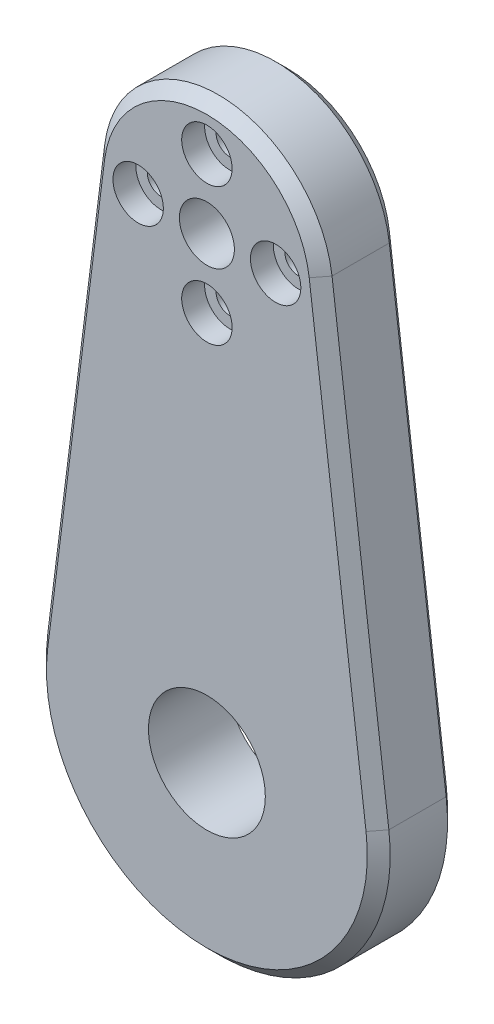
ISO-10303-21;
HEADER;
FILE_DESCRIPTION(('STEP AP214'),'2;1');
FILE_NAME('part.step','',(''),(''),'','','');
FILE_SCHEMA(('AUTOMOTIVE_DESIGN { 1 0 10303 214 1 1 1 1 }'));
ENDSEC;
DATA;
#1=APPLICATION_CONTEXT('core data for automotive mechanical design processes');
#2=APPLICATION_PROTOCOL_DEFINITION('international standard','automotive_design',2000,#1);
#3=PRODUCT_CONTEXT('',#1,'mechanical');
#4=PRODUCT('Part','Part','',(#3));
#5=PRODUCT_RELATED_PRODUCT_CATEGORY('part','',(#4));
#6=PRODUCT_DEFINITION_FORMATION('','',#4);
#7=PRODUCT_DEFINITION_CONTEXT('part definition',#1,'design');
#8=PRODUCT_DEFINITION('design','',#6,#7);
#9=PRODUCT_DEFINITION_SHAPE('','',#8);
#10=(LENGTH_UNIT() NAMED_UNIT(*) SI_UNIT(.MILLI.,.METRE.));
#11=(NAMED_UNIT(*) PLANE_ANGLE_UNIT() SI_UNIT($,.RADIAN.));
#12=(NAMED_UNIT(*) SI_UNIT($,.STERADIAN.) SOLID_ANGLE_UNIT());
#13=UNCERTAINTY_MEASURE_WITH_UNIT(LENGTH_MEASURE(1.E-05),#10,'distance_accuracy_value','');
#14=(GEOMETRIC_REPRESENTATION_CONTEXT(3) GLOBAL_UNCERTAINTY_ASSIGNED_CONTEXT((#13)) GLOBAL_UNIT_ASSIGNED_CONTEXT((#10,
#11,#12)) REPRESENTATION_CONTEXT('',''));
#15=CARTESIAN_POINT('',(0.,0.,0.));
#16=DIRECTION('',(0.,0.,1.));
#17=DIRECTION('',(1.,0.,0.));
#18=AXIS2_PLACEMENT_3D('',#15,#16,#17);
#19=CARTESIAN_POINT('',(0.,-40.,7.));
#20=DIRECTION('',(0.,0.,1.));
#21=DIRECTION('',(1.,0.,0.));
#22=AXIS2_PLACEMENT_3D('',#19,#20,#21);
#23=PLANE('',#22);
#24=CARTESIAN_POINT('',(0.,-40.,7.));
#25=DIRECTION('',(0.,0.,1.));
#26=DIRECTION('',(1.,0.,0.));
#27=AXIS2_PLACEMENT_3D('',#24,#25,#26);
#28=CIRCLE('',#27,14.);
#29=CARTESIAN_POINT('',(-13.8901943830891,-38.25,7.));
#30=VERTEX_POINT('',#29);
#31=CARTESIAN_POINT('',(13.8901943830891,-38.25,7.));
#32=VERTEX_POINT('',#31);
#33=EDGE_CURVE('E67',#30,#32,#28,.T.);
#34=ORIENTED_EDGE('',*,*,#33,.T.);
#35=DIRECTION('',(-0.125,0.992156741649222,0.));
#36=VECTOR('',#35,1.);
#37=CARTESIAN_POINT('',(8.929410674843,1.125,7.));
#38=LINE('',#37,#36);
#39=CARTESIAN_POINT('',(8.929410674843,1.125,7.));
#40=VERTEX_POINT('',#39);
#41=EDGE_CURVE('E11',#32,#40,#38,.T.);
#42=ORIENTED_EDGE('',*,*,#41,.T.);
#43=CARTESIAN_POINT('',(0.,0.,7.));
#44=DIRECTION('',(0.,0.,1.));
#45=DIRECTION('',(1.,0.,0.));
#46=AXIS2_PLACEMENT_3D('',#43,#44,#45);
#47=CIRCLE('',#46,9.00000000000001);
#48=CARTESIAN_POINT('',(-8.929410674843,1.125,7.));
#49=VERTEX_POINT('',#48);
#50=EDGE_CURVE('E52',#40,#49,#47,.T.);
#51=ORIENTED_EDGE('',*,*,#50,.T.);
#52=DIRECTION('',(-0.125,-0.992156741649222,0.));
#53=VECTOR('',#52,1.);
#54=CARTESIAN_POINT('',(-13.8901943830891,-38.25,7.));
#55=LINE('',#54,#53);
#56=EDGE_CURVE('E299',#49,#30,#55,.T.);
#57=ORIENTED_EDGE('',*,*,#56,.T.);
#58=EDGE_LOOP('',(#34,#42,#51,#57));
#59=FACE_BOUND('',#58,.T.);
#60=CARTESIAN_POINT('',(0.,6.,7.));
#61=DIRECTION('',(0.,0.,1.));
#62=DIRECTION('',(1.,0.,0.));
#63=AXIS2_PLACEMENT_3D('',#60,#61,#62);
#64=CIRCLE('',#63,2.19999999999999);
#65=CARTESIAN_POINT('',(2.19999999999999,6.,7.));
#66=VERTEX_POINT('',#65);
#67=EDGE_CURVE('E176',#66,#66,#64,.T.);
#68=ORIENTED_EDGE('',*,*,#67,.F.);
#69=EDGE_LOOP('',(#68));
#70=FACE_BOUND('',#69,.T.);
#71=CARTESIAN_POINT('',(6.,0.,7.));
#72=DIRECTION('',(0.,0.,1.));
#73=DIRECTION('',(1.,0.,0.));
#74=AXIS2_PLACEMENT_3D('',#71,#72,#73);
#75=CIRCLE('',#74,2.19999999999999);
#76=CARTESIAN_POINT('',(8.19999999999999,0.,7.));
#77=VERTEX_POINT('',#76);
#78=EDGE_CURVE('E199',#77,#77,#75,.T.);
#79=ORIENTED_EDGE('',*,*,#78,.F.);
#80=EDGE_LOOP('',(#79));
#81=FACE_BOUND('',#80,.T.);
#82=CARTESIAN_POINT('',(0.,-6.,7.));
#83=DIRECTION('',(0.,0.,1.));
#84=DIRECTION('',(1.,0.,0.));
#85=AXIS2_PLACEMENT_3D('',#82,#83,#84);
#86=CIRCLE('',#85,2.19999999999999);
#87=CARTESIAN_POINT('',(2.19999999999999,-6.,7.));
#88=VERTEX_POINT('',#87);
#89=EDGE_CURVE('E215',#88,#88,#86,.T.);
#90=ORIENTED_EDGE('',*,*,#89,.F.);
#91=EDGE_LOOP('',(#90));
#92=FACE_BOUND('',#91,.T.);
#93=CARTESIAN_POINT('',(-6.,0.,7.));
#94=DIRECTION('',(0.,0.,1.));
#95=DIRECTION('',(1.,0.,0.));
#96=AXIS2_PLACEMENT_3D('',#93,#94,#95);
#97=CIRCLE('',#96,2.19999999999999);
#98=CARTESIAN_POINT('',(-3.80000000000001,0.,7.));
#99=VERTEX_POINT('',#98);
#100=EDGE_CURVE('E231',#99,#99,#97,.T.);
#101=ORIENTED_EDGE('',*,*,#100,.F.);
#102=EDGE_LOOP('',(#101));
#103=FACE_BOUND('',#102,.T.);
#104=CARTESIAN_POINT('',(0.,0.,7.));
#105=DIRECTION('',(0.,0.,1.));
#106=DIRECTION('',(1.,0.,0.));
#107=AXIS2_PLACEMENT_3D('',#104,#105,#106);
#108=CIRCLE('',#107,2.4);
#109=CARTESIAN_POINT('',(2.4,0.,7.));
#110=VERTEX_POINT('',#109);
#111=EDGE_CURVE('E256',#110,#110,#108,.T.);
#112=ORIENTED_EDGE('',*,*,#111,.F.);
#113=EDGE_LOOP('',(#112));
#114=FACE_BOUND('',#113,.T.);
#115=CARTESIAN_POINT('',(0.,-40.,7.));
#116=DIRECTION('',(0.,0.,1.));
#117=DIRECTION('',(1.,0.,0.));
#118=AXIS2_PLACEMENT_3D('',#115,#116,#117);
#119=CIRCLE('',#118,5.1);
#120=CARTESIAN_POINT('',(5.1,-40.,7.));
#121=VERTEX_POINT('',#120);
#122=EDGE_CURVE('E248',#121,#121,#119,.T.);
#123=ORIENTED_EDGE('',*,*,#122,.F.);
#124=EDGE_LOOP('',(#123));
#125=FACE_BOUND('',#124,.T.);
#126=ADVANCED_FACE('F41',(#59,#70,#81,#92,#103,#114,#125),#23,.T.);
#127=CARTESIAN_POINT('',(0.,-40.,0.));
#128=DIRECTION('',(0.,0.,1.));
#129=DIRECTION('',(1.,0.,0.));
#130=AXIS2_PLACEMENT_3D('',#127,#128,#129);
#131=PLANE('',#130);
#132=CARTESIAN_POINT('',(0.,0.,0.));
#133=DIRECTION('',(0.,0.,1.));
#134=DIRECTION('',(1.,0.,0.));
#135=AXIS2_PLACEMENT_3D('',#132,#133,#134);
#136=CIRCLE('',#135,8.99999999999999);
#137=CARTESIAN_POINT('',(-8.92941067484298,1.125,0.));
#138=VERTEX_POINT('',#137);
#139=CARTESIAN_POINT('',(8.92941067484298,1.125,0.));
#140=VERTEX_POINT('',#139);
#141=EDGE_CURVE('E279',#138,#140,#136,.F.);
#142=ORIENTED_EDGE('',*,*,#141,.T.);
#143=DIRECTION('',(0.125,-0.992156741649222,0.));
#144=VECTOR('',#143,1.);
#145=CARTESIAN_POINT('',(13.8901943830891,-38.25,0.));
#146=LINE('',#145,#144);
#147=CARTESIAN_POINT('',(13.8901943830891,-38.25,0.));
#148=VERTEX_POINT('',#147);
#149=EDGE_CURVE('E124',#140,#148,#146,.T.);
#150=ORIENTED_EDGE('',*,*,#149,.T.);
#151=CARTESIAN_POINT('',(0.,-40.,0.));
#152=DIRECTION('',(0.,0.,1.));
#153=DIRECTION('',(1.,0.,0.));
#154=AXIS2_PLACEMENT_3D('',#151,#152,#153);
#155=CIRCLE('',#154,14.);
#156=CARTESIAN_POINT('',(-13.8901943830891,-38.25,0.));
#157=VERTEX_POINT('',#156);
#158=EDGE_CURVE('E276',#148,#157,#155,.F.);
#159=ORIENTED_EDGE('',*,*,#158,.T.);
#160=DIRECTION('',(0.125,0.992156741649222,0.));
#161=VECTOR('',#160,1.);
#162=CARTESIAN_POINT('',(-13.8901943830891,-38.25,0.));
#163=LINE('',#162,#161);
#164=EDGE_CURVE('E273',#157,#138,#163,.T.);
#165=ORIENTED_EDGE('',*,*,#164,.T.);
#166=EDGE_LOOP('',(#142,#150,#159,#165));
#167=FACE_BOUND('',#166,.T.);
#168=CARTESIAN_POINT('',(0.,6.,0.));
#169=DIRECTION('',(0.,0.,1.));
#170=DIRECTION('',(1.,0.,0.));
#171=AXIS2_PLACEMENT_3D('',#168,#169,#170);
#172=CIRCLE('',#171,1.2);
#173=CARTESIAN_POINT('',(1.2,6.,0.));
#174=VERTEX_POINT('',#173);
#175=EDGE_CURVE('E195',#174,#174,#172,.T.);
#176=ORIENTED_EDGE('',*,*,#175,.T.);
#177=EDGE_LOOP('',(#176));
#178=FACE_BOUND('',#177,.T.);
#179=CARTESIAN_POINT('',(6.,0.,0.));
#180=DIRECTION('',(0.,0.,1.));
#181=DIRECTION('',(1.,0.,0.));
#182=AXIS2_PLACEMENT_3D('',#179,#180,#181);
#183=CIRCLE('',#182,1.2);
#184=CARTESIAN_POINT('',(7.2,0.,0.));
#185=VERTEX_POINT('',#184);
#186=EDGE_CURVE('E211',#185,#185,#183,.T.);
#187=ORIENTED_EDGE('',*,*,#186,.T.);
#188=EDGE_LOOP('',(#187));
#189=FACE_BOUND('',#188,.T.);
#190=CARTESIAN_POINT('',(0.,-6.,0.));
#191=DIRECTION('',(0.,0.,1.));
#192=DIRECTION('',(1.,0.,0.));
#193=AXIS2_PLACEMENT_3D('',#190,#191,#192);
#194=CIRCLE('',#193,1.2);
#195=CARTESIAN_POINT('',(1.2,-6.,0.));
#196=VERTEX_POINT('',#195);
#197=EDGE_CURVE('E227',#196,#196,#194,.T.);
#198=ORIENTED_EDGE('',*,*,#197,.T.);
#199=EDGE_LOOP('',(#198));
#200=FACE_BOUND('',#199,.T.);
#201=CARTESIAN_POINT('',(-6.,0.,0.));
#202=DIRECTION('',(0.,0.,1.));
#203=DIRECTION('',(1.,0.,0.));
#204=AXIS2_PLACEMENT_3D('',#201,#202,#203);
#205=CIRCLE('',#204,1.2);
#206=CARTESIAN_POINT('',(-4.8,0.,0.));
#207=VERTEX_POINT('',#206);
#208=EDGE_CURVE('E243',#207,#207,#205,.T.);
#209=ORIENTED_EDGE('',*,*,#208,.T.);
#210=EDGE_LOOP('',(#209));
#211=FACE_BOUND('',#210,.T.);
#212=CARTESIAN_POINT('',(0.,0.,0.));
#213=DIRECTION('',(0.,0.,1.));
#214=DIRECTION('',(1.,0.,0.));
#215=AXIS2_PLACEMENT_3D('',#212,#213,#214);
#216=CIRCLE('',#215,2.4);
#217=CARTESIAN_POINT('',(2.4,0.,0.));
#218=VERTEX_POINT('',#217);
#219=EDGE_CURVE('E252',#218,#218,#216,.T.);
#220=ORIENTED_EDGE('',*,*,#219,.T.);
#221=EDGE_LOOP('',(#220));
#222=FACE_BOUND('',#221,.T.);
#223=CARTESIAN_POINT('',(0.,-40.,0.));
#224=DIRECTION('',(0.,0.,1.));
#225=DIRECTION('',(1.,0.,0.));
#226=AXIS2_PLACEMENT_3D('',#223,#224,#225);
#227=CIRCLE('',#226,5.1);
#228=CARTESIAN_POINT('',(5.1,-40.,0.));
#229=VERTEX_POINT('',#228);
#230=EDGE_CURVE('E247',#229,#229,#227,.T.);
#231=ORIENTED_EDGE('',*,*,#230,.T.);
#232=EDGE_LOOP('',(#231));
#233=FACE_BOUND('',#232,.T.);
#234=ADVANCED_FACE('F332',(#167,#178,#189,#200,#211,#222,#233),#131,.F.);
#235=CARTESIAN_POINT('',(0.,-40.,7.));
#236=DIRECTION('',(0.,0.,-1.));
#237=DIRECTION('',(-1.,0.,0.));
#238=AXIS2_PLACEMENT_3D('',#235,#236,#237);
#239=CYLINDRICAL_SURFACE('',#238,15.);
#240=DIRECTION('',(0.,0.,-1.));
#241=VECTOR('',#240,1.);
#242=CARTESIAN_POINT('',(-14.8823511247383,-38.125,7.));
#243=LINE('',#242,#241);
#244=CARTESIAN_POINT('',(-14.8823511247383,-38.125,6.00000000000001));
#245=VERTEX_POINT('',#244);
#246=CARTESIAN_POINT('',(-14.8823511247383,-38.125,1.00000000000001));
#247=VERTEX_POINT('',#246);
#248=EDGE_CURVE('E260',#245,#247,#243,.T.);
#249=ORIENTED_EDGE('',*,*,#248,.T.);
#250=CARTESIAN_POINT('',(0.,-40.,1.00000000000001));
#251=DIRECTION('',(0.,0.,1.));
#252=DIRECTION('',(1.,0.,0.));
#253=AXIS2_PLACEMENT_3D('',#250,#251,#252);
#254=CIRCLE('',#253,15.);
#255=CARTESIAN_POINT('',(14.8823511247383,-38.125,1.00000000000001));
#256=VERTEX_POINT('',#255);
#257=EDGE_CURVE('E290',#247,#256,#254,.T.);
#258=ORIENTED_EDGE('',*,*,#257,.T.);
#259=DIRECTION('',(0.,0.,-1.));
#260=VECTOR('',#259,1.);
#261=CARTESIAN_POINT('',(14.8823511247383,-38.125,7.));
#262=LINE('',#261,#260);
#263=CARTESIAN_POINT('',(14.8823511247383,-38.125,6.00000000000001));
#264=VERTEX_POINT('',#263);
#265=EDGE_CURVE('E136',#264,#256,#262,.T.);
#266=ORIENTED_EDGE('',*,*,#265,.F.);
#267=CARTESIAN_POINT('',(0.,-40.,6.00000000000001));
#268=DIRECTION('',(0.,0.,1.));
#269=DIRECTION('',(1.,0.,0.));
#270=AXIS2_PLACEMENT_3D('',#267,#268,#269);
#271=CIRCLE('',#270,15.);
#272=EDGE_CURVE('E287',#264,#245,#271,.F.);
#273=ORIENTED_EDGE('',*,*,#272,.T.);
#274=EDGE_LOOP('',(#249,#258,#266,#273));
#275=FACE_BOUND('',#274,.T.);
#276=ADVANCED_FACE('F311',(#275),#239,.T.);
#277=CARTESIAN_POINT('',(14.8823511247383,-38.125,7.));
#278=DIRECTION('',(-0.992156741649221,-0.125,0.));
#279=DIRECTION('',(0.125,-0.992156741649222,0.));
#280=AXIS2_PLACEMENT_3D('',#277,#278,#279);
#281=PLANE('',#280);
#282=ORIENTED_EDGE('',*,*,#265,.T.);
#283=DIRECTION('',(-0.125,0.992156741649222,0.));
#284=VECTOR('',#283,1.);
#285=CARTESIAN_POINT('',(14.8823511247383,-38.125,1.00000000000001));
#286=LINE('',#285,#284);
#287=CARTESIAN_POINT('',(9.92156741649221,1.25,1.00000000000001));
#288=VERTEX_POINT('',#287);
#289=EDGE_CURVE('E134',#256,#288,#286,.T.);
#290=ORIENTED_EDGE('',*,*,#289,.T.);
#291=DIRECTION('',(0.,0.,-1.));
#292=VECTOR('',#291,1.);
#293=CARTESIAN_POINT('',(9.92156741649221,1.25,7.));
#294=LINE('',#293,#292);
#295=CARTESIAN_POINT('',(9.92156741649221,1.25,6.00000000000001));
#296=VERTEX_POINT('',#295);
#297=EDGE_CURVE('E116',#296,#288,#294,.T.);
#298=ORIENTED_EDGE('',*,*,#297,.F.);
#299=DIRECTION('',(0.125,-0.992156741649222,0.));
#300=VECTOR('',#299,1.);
#301=CARTESIAN_POINT('',(14.8823511247383,-38.125,6.00000000000001));
#302=LINE('',#301,#300);
#303=EDGE_CURVE('E131',#296,#264,#302,.T.);
#304=ORIENTED_EDGE('',*,*,#303,.T.);
#305=EDGE_LOOP('',(#282,#290,#298,#304));
#306=FACE_BOUND('',#305,.T.);
#307=ADVANCED_FACE('F130',(#306),#281,.F.);
#308=CARTESIAN_POINT('',(0.,0.,7.));
#309=DIRECTION('',(0.,0.,-1.));
#310=DIRECTION('',(-1.,0.,0.));
#311=AXIS2_PLACEMENT_3D('',#308,#309,#310);
#312=CYLINDRICAL_SURFACE('',#311,10.);
#313=ORIENTED_EDGE('',*,*,#297,.T.);
#314=CARTESIAN_POINT('',(0.,0.,1.00000000000001));
#315=DIRECTION('',(0.,0.,1.));
#316=DIRECTION('',(1.,0.,0.));
#317=AXIS2_PLACEMENT_3D('',#314,#315,#316);
#318=CIRCLE('',#317,10.);
#319=CARTESIAN_POINT('',(-9.92156741649221,1.25,1.00000000000001));
#320=VERTEX_POINT('',#319);
#321=EDGE_CURVE('E123',#288,#320,#318,.T.);
#322=ORIENTED_EDGE('',*,*,#321,.T.);
#323=DIRECTION('',(0.,0.,-1.));
#324=VECTOR('',#323,1.);
#325=CARTESIAN_POINT('',(-9.92156741649221,1.25,7.));
#326=LINE('',#325,#324);
#327=CARTESIAN_POINT('',(-9.92156741649221,1.25,6.00000000000001));
#328=VERTEX_POINT('',#327);
#329=EDGE_CURVE('E118',#328,#320,#326,.T.);
#330=ORIENTED_EDGE('',*,*,#329,.F.);
#331=CARTESIAN_POINT('',(0.,0.,6.00000000000001));
#332=DIRECTION('',(0.,0.,1.));
#333=DIRECTION('',(1.,0.,0.));
#334=AXIS2_PLACEMENT_3D('',#331,#332,#333);
#335=CIRCLE('',#334,10.);
#336=EDGE_CURVE('E113',#328,#296,#335,.F.);
#337=ORIENTED_EDGE('',*,*,#336,.T.);
#338=EDGE_LOOP('',(#313,#322,#330,#337));
#339=FACE_BOUND('',#338,.T.);
#340=ADVANCED_FACE('F115',(#339),#312,.T.);
#341=CARTESIAN_POINT('',(-14.8823511247383,-38.125,7.));
#342=DIRECTION('',(0.992156741649221,-0.125,0.));
#343=DIRECTION('',(0.125,0.992156741649222,0.));
#344=AXIS2_PLACEMENT_3D('',#341,#342,#343);
#345=PLANE('',#344);
#346=ORIENTED_EDGE('',*,*,#329,.T.);
#347=DIRECTION('',(-0.125,-0.992156741649222,0.));
#348=VECTOR('',#347,1.);
#349=CARTESIAN_POINT('',(-14.8823511247383,-38.125,1.00000000000001));
#350=LINE('',#349,#348);
#351=EDGE_CURVE('E296',#320,#247,#350,.T.);
#352=ORIENTED_EDGE('',*,*,#351,.T.);
#353=ORIENTED_EDGE('',*,*,#248,.F.);
#354=DIRECTION('',(0.125,0.992156741649222,0.));
#355=VECTOR('',#354,1.);
#356=CARTESIAN_POINT('',(-9.92156741649221,1.25,6.00000000000001));
#357=LINE('',#356,#355);
#358=EDGE_CURVE('E293',#245,#328,#357,.T.);
#359=ORIENTED_EDGE('',*,*,#358,.T.);
#360=EDGE_LOOP('',(#346,#352,#353,#359));
#361=FACE_BOUND('',#360,.T.);
#362=ADVANCED_FACE('F313',(#361),#345,.F.);
#363=CARTESIAN_POINT('',(0.,0.,7.));
#364=DIRECTION('',(0.,0.,-1.));
#365=DIRECTION('',(-1.,0.,0.));
#366=AXIS2_PLACEMENT_3D('',#363,#364,#365);
#367=CYLINDRICAL_SURFACE('',#366,2.4);
#368=ORIENTED_EDGE('',*,*,#111,.T.);
#369=EDGE_LOOP('',(#368));
#370=FACE_BOUND('',#369,.T.);
#371=ORIENTED_EDGE('',*,*,#219,.F.);
#372=EDGE_LOOP('',(#371));
#373=FACE_BOUND('',#372,.T.);
#374=ADVANCED_FACE('F340',(#370,#373),#367,.F.);
#375=CARTESIAN_POINT('',(0.,-40.,7.));
#376=DIRECTION('',(0.,0.,-1.));
#377=DIRECTION('',(-1.,0.,0.));
#378=AXIS2_PLACEMENT_3D('',#375,#376,#377);
#379=CYLINDRICAL_SURFACE('',#378,5.1);
#380=ORIENTED_EDGE('',*,*,#122,.T.);
#381=EDGE_LOOP('',(#380));
#382=FACE_BOUND('',#381,.T.);
#383=ORIENTED_EDGE('',*,*,#230,.F.);
#384=EDGE_LOOP('',(#383));
#385=FACE_BOUND('',#384,.T.);
#386=ADVANCED_FACE('F372',(#382,#385),#379,.F.);
#387=CARTESIAN_POINT('',(-6.,0.,7.));
#388=DIRECTION('',(0.,0.,1.));
#389=DIRECTION('',(1.,0.,0.));
#390=AXIS2_PLACEMENT_3D('',#387,#388,#389);
#391=CYLINDRICAL_SURFACE('',#390,1.2);
#392=ORIENTED_EDGE('',*,*,#208,.F.);
#393=EDGE_LOOP('',(#392));
#394=FACE_BOUND('',#393,.T.);
#395=CARTESIAN_POINT('',(-6.,0.,5.));
#396=DIRECTION('',(0.,0.,1.));
#397=DIRECTION('',(1.,0.,0.));
#398=AXIS2_PLACEMENT_3D('',#395,#396,#397);
#399=CIRCLE('',#398,1.2);
#400=CARTESIAN_POINT('',(-4.8,0.,5.));
#401=VERTEX_POINT('',#400);
#402=EDGE_CURVE('E239',#401,#401,#399,.T.);
#403=ORIENTED_EDGE('',*,*,#402,.T.);
#404=EDGE_LOOP('',(#403));
#405=FACE_BOUND('',#404,.T.);
#406=ADVANCED_FACE('F379',(#394,#405),#391,.F.);
#407=CARTESIAN_POINT('',(-4.8,0.,5.));
#408=DIRECTION('',(0.,0.,-1.));
#409=DIRECTION('',(-1.,0.,0.));
#410=AXIS2_PLACEMENT_3D('',#407,#408,#409);
#411=PLANE('',#410);
#412=ORIENTED_EDGE('',*,*,#402,.F.);
#413=EDGE_LOOP('',(#412));
#414=FACE_BOUND('',#413,.T.);
#415=CARTESIAN_POINT('',(-6.,0.,5.));
#416=DIRECTION('',(0.,0.,1.));
#417=DIRECTION('',(1.,0.,0.));
#418=AXIS2_PLACEMENT_3D('',#415,#416,#417);
#419=CIRCLE('',#418,2.2);
#420=CARTESIAN_POINT('',(-3.8,0.,5.));
#421=VERTEX_POINT('',#420);
#422=EDGE_CURVE('E235',#421,#421,#419,.T.);
#423=ORIENTED_EDGE('',*,*,#422,.T.);
#424=EDGE_LOOP('',(#423));
#425=FACE_BOUND('',#424,.T.);
#426=ADVANCED_FACE('F386',(#414,#425),#411,.F.);
#427=CARTESIAN_POINT('',(-6.,0.,7.));
#428=DIRECTION('',(0.,0.,1.));
#429=DIRECTION('',(1.,0.,0.));
#430=AXIS2_PLACEMENT_3D('',#427,#428,#429);
#431=CYLINDRICAL_SURFACE('',#430,2.19999999999999);
#432=ORIENTED_EDGE('',*,*,#422,.F.);
#433=EDGE_LOOP('',(#432));
#434=FACE_BOUND('',#433,.T.);
#435=ORIENTED_EDGE('',*,*,#100,.T.);
#436=EDGE_LOOP('',(#435));
#437=FACE_BOUND('',#436,.T.);
#438=ADVANCED_FACE('F394',(#434,#437),#431,.F.);
#439=CARTESIAN_POINT('',(0.,-6.,7.));
#440=DIRECTION('',(0.,0.,1.));
#441=DIRECTION('',(1.,0.,0.));
#442=AXIS2_PLACEMENT_3D('',#439,#440,#441);
#443=CYLINDRICAL_SURFACE('',#442,1.2);
#444=ORIENTED_EDGE('',*,*,#197,.F.);
#445=EDGE_LOOP('',(#444));
#446=FACE_BOUND('',#445,.T.);
#447=CARTESIAN_POINT('',(0.,-6.,5.));
#448=DIRECTION('',(0.,0.,1.));
#449=DIRECTION('',(1.,0.,0.));
#450=AXIS2_PLACEMENT_3D('',#447,#448,#449);
#451=CIRCLE('',#450,1.2);
#452=CARTESIAN_POINT('',(1.2,-6.,5.));
#453=VERTEX_POINT('',#452);
#454=EDGE_CURVE('E223',#453,#453,#451,.T.);
#455=ORIENTED_EDGE('',*,*,#454,.T.);
#456=EDGE_LOOP('',(#455));
#457=FACE_BOUND('',#456,.T.);
#458=ADVANCED_FACE('F402',(#446,#457),#443,.F.);
#459=CARTESIAN_POINT('',(1.2,-6.,5.));
#460=DIRECTION('',(0.,0.,-1.));
#461=DIRECTION('',(-1.,0.,0.));
#462=AXIS2_PLACEMENT_3D('',#459,#460,#461);
#463=PLANE('',#462);
#464=ORIENTED_EDGE('',*,*,#454,.F.);
#465=EDGE_LOOP('',(#464));
#466=FACE_BOUND('',#465,.T.);
#467=CARTESIAN_POINT('',(0.,-6.,5.));
#468=DIRECTION('',(0.,0.,1.));
#469=DIRECTION('',(1.,0.,0.));
#470=AXIS2_PLACEMENT_3D('',#467,#468,#469);
#471=CIRCLE('',#470,2.2);
#472=CARTESIAN_POINT('',(2.2,-6.,5.));
#473=VERTEX_POINT('',#472);
#474=EDGE_CURVE('E219',#473,#473,#471,.T.);
#475=ORIENTED_EDGE('',*,*,#474,.T.);
#476=EDGE_LOOP('',(#475));
#477=FACE_BOUND('',#476,.T.);
#478=ADVANCED_FACE('F410',(#466,#477),#463,.F.);
#479=CARTESIAN_POINT('',(0.,-6.,7.));
#480=DIRECTION('',(0.,0.,1.));
#481=DIRECTION('',(1.,0.,0.));
#482=AXIS2_PLACEMENT_3D('',#479,#480,#481);
#483=CYLINDRICAL_SURFACE('',#482,2.19999999999999);
#484=ORIENTED_EDGE('',*,*,#474,.F.);
#485=EDGE_LOOP('',(#484));
#486=FACE_BOUND('',#485,.T.);
#487=ORIENTED_EDGE('',*,*,#89,.T.);
#488=EDGE_LOOP('',(#487));
#489=FACE_BOUND('',#488,.T.);
#490=ADVANCED_FACE('F418',(#486,#489),#483,.F.);
#491=CARTESIAN_POINT('',(6.,0.,7.));
#492=DIRECTION('',(0.,0.,1.));
#493=DIRECTION('',(1.,0.,0.));
#494=AXIS2_PLACEMENT_3D('',#491,#492,#493);
#495=CYLINDRICAL_SURFACE('',#494,1.2);
#496=ORIENTED_EDGE('',*,*,#186,.F.);
#497=EDGE_LOOP('',(#496));
#498=FACE_BOUND('',#497,.T.);
#499=CARTESIAN_POINT('',(6.,0.,5.));
#500=DIRECTION('',(0.,0.,1.));
#501=DIRECTION('',(1.,0.,0.));
#502=AXIS2_PLACEMENT_3D('',#499,#500,#501);
#503=CIRCLE('',#502,1.2);
#504=CARTESIAN_POINT('',(7.2,0.,5.));
#505=VERTEX_POINT('',#504);
#506=EDGE_CURVE('E207',#505,#505,#503,.T.);
#507=ORIENTED_EDGE('',*,*,#506,.T.);
#508=EDGE_LOOP('',(#507));
#509=FACE_BOUND('',#508,.T.);
#510=ADVANCED_FACE('F426',(#498,#509),#495,.F.);
#511=CARTESIAN_POINT('',(7.2,0.,5.));
#512=DIRECTION('',(0.,0.,-1.));
#513=DIRECTION('',(-1.,0.,0.));
#514=AXIS2_PLACEMENT_3D('',#511,#512,#513);
#515=PLANE('',#514);
#516=ORIENTED_EDGE('',*,*,#506,.F.);
#517=EDGE_LOOP('',(#516));
#518=FACE_BOUND('',#517,.T.);
#519=CARTESIAN_POINT('',(6.,0.,5.));
#520=DIRECTION('',(0.,0.,1.));
#521=DIRECTION('',(1.,0.,0.));
#522=AXIS2_PLACEMENT_3D('',#519,#520,#521);
#523=CIRCLE('',#522,2.2);
#524=CARTESIAN_POINT('',(8.2,0.,5.));
#525=VERTEX_POINT('',#524);
#526=EDGE_CURVE('E203',#525,#525,#523,.T.);
#527=ORIENTED_EDGE('',*,*,#526,.T.);
#528=EDGE_LOOP('',(#527));
#529=FACE_BOUND('',#528,.T.);
#530=ADVANCED_FACE('F434',(#518,#529),#515,.F.);
#531=CARTESIAN_POINT('',(6.,0.,7.));
#532=DIRECTION('',(0.,0.,1.));
#533=DIRECTION('',(1.,0.,0.));
#534=AXIS2_PLACEMENT_3D('',#531,#532,#533);
#535=CYLINDRICAL_SURFACE('',#534,2.19999999999999);
#536=ORIENTED_EDGE('',*,*,#526,.F.);
#537=EDGE_LOOP('',(#536));
#538=FACE_BOUND('',#537,.T.);
#539=ORIENTED_EDGE('',*,*,#78,.T.);
#540=EDGE_LOOP('',(#539));
#541=FACE_BOUND('',#540,.T.);
#542=ADVANCED_FACE('F442',(#538,#541),#535,.F.);
#543=CARTESIAN_POINT('',(0.,6.,7.));
#544=DIRECTION('',(0.,0.,1.));
#545=DIRECTION('',(1.,0.,0.));
#546=AXIS2_PLACEMENT_3D('',#543,#544,#545);
#547=CYLINDRICAL_SURFACE('',#546,1.2);
#548=ORIENTED_EDGE('',*,*,#175,.F.);
#549=EDGE_LOOP('',(#548));
#550=FACE_BOUND('',#549,.T.);
#551=CARTESIAN_POINT('',(0.,6.,5.));
#552=DIRECTION('',(0.,0.,1.));
#553=DIRECTION('',(1.,0.,0.));
#554=AXIS2_PLACEMENT_3D('',#551,#552,#553);
#555=CIRCLE('',#554,1.2);
#556=CARTESIAN_POINT('',(1.2,6.,5.));
#557=VERTEX_POINT('',#556);
#558=EDGE_CURVE('E189',#557,#557,#555,.T.);
#559=ORIENTED_EDGE('',*,*,#558,.T.);
#560=EDGE_LOOP('',(#559));
#561=FACE_BOUND('',#560,.T.);
#562=ADVANCED_FACE('F450',(#550,#561),#547,.F.);
#563=CARTESIAN_POINT('',(1.2,6.,5.));
#564=DIRECTION('',(0.,0.,-1.));
#565=DIRECTION('',(-1.,0.,0.));
#566=AXIS2_PLACEMENT_3D('',#563,#564,#565);
#567=PLANE('',#566);
#568=ORIENTED_EDGE('',*,*,#558,.F.);
#569=EDGE_LOOP('',(#568));
#570=FACE_BOUND('',#569,.T.);
#571=CARTESIAN_POINT('',(0.,6.,5.));
#572=DIRECTION('',(0.,0.,1.));
#573=DIRECTION('',(1.,0.,0.));
#574=AXIS2_PLACEMENT_3D('',#571,#572,#573);
#575=CIRCLE('',#574,2.2);
#576=CARTESIAN_POINT('',(2.2,6.,5.));
#577=VERTEX_POINT('',#576);
#578=EDGE_CURVE('E183',#577,#577,#575,.T.);
#579=ORIENTED_EDGE('',*,*,#578,.T.);
#580=EDGE_LOOP('',(#579));
#581=FACE_BOUND('',#580,.T.);
#582=ADVANCED_FACE('F458',(#570,#581),#567,.F.);
#583=CARTESIAN_POINT('',(0.,6.,7.));
#584=DIRECTION('',(0.,0.,1.));
#585=DIRECTION('',(1.,0.,0.));
#586=AXIS2_PLACEMENT_3D('',#583,#584,#585);
#587=CYLINDRICAL_SURFACE('',#586,2.19999999999999);
#588=ORIENTED_EDGE('',*,*,#578,.F.);
#589=EDGE_LOOP('',(#588));
#590=FACE_BOUND('',#589,.T.);
#591=ORIENTED_EDGE('',*,*,#67,.T.);
#592=EDGE_LOOP('',(#591));
#593=FACE_BOUND('',#592,.T.);
#594=ADVANCED_FACE('F466',(#590,#593),#587,.F.);
#595=CARTESIAN_POINT('',(-14.8823511247383,-38.125,1.00000000000001));
#596=DIRECTION('',(0.701560760020114,-0.0883883476483183,0.707106781186547));
#597=DIRECTION('',(-0.125,-0.992156741649222,0.));
#598=AXIS2_PLACEMENT_3D('',#595,#596,#597);
#599=PLANE('',#598);
#600=DIRECTION('',(-0.701560760020114,0.0883883476483183,0.707106781186548));
#601=VECTOR('',#600,1.);
#602=CARTESIAN_POINT('',(-8.92941067484298,1.125,0.));
#603=LINE('',#602,#601);
#604=EDGE_CURVE('E166',#138,#320,#603,.T.);
#605=ORIENTED_EDGE('',*,*,#604,.F.);
#606=ORIENTED_EDGE('',*,*,#164,.F.);
#607=DIRECTION('',(0.701560760020114,-0.0883883476483178,-0.707106781186548));
#608=VECTOR('',#607,1.);
#609=CARTESIAN_POINT('',(-14.8823511247383,-38.125,1.00000000000001));
#610=LINE('',#609,#608);
#611=EDGE_CURVE('E150',#247,#157,#610,.T.);
#612=ORIENTED_EDGE('',*,*,#611,.F.);
#613=ORIENTED_EDGE('',*,*,#351,.F.);
#614=EDGE_LOOP('',(#605,#606,#612,#613));
#615=FACE_BOUND('',#614,.T.);
#616=ADVANCED_FACE('F316',(#615),#599,.F.);
#617=CARTESIAN_POINT('',(0.,-40.,1.00000000000001));
#618=DIRECTION('',(0.,0.,1.));
#619=DIRECTION('',(1.,0.,0.));
#620=AXIS2_PLACEMENT_3D('',#617,#618,#619);
#621=CONICAL_SURFACE('',#620,15.,0.785398163397448);
#622=ORIENTED_EDGE('',*,*,#611,.T.);
#623=ORIENTED_EDGE('',*,*,#158,.F.);
#624=DIRECTION('',(-0.701560760020114,-0.0883883476483178,-0.707106781186548));
#625=VECTOR('',#624,1.);
#626=CARTESIAN_POINT('',(14.8823511247383,-38.125,1.00000000000001));
#627=LINE('',#626,#625);
#628=EDGE_CURVE('E159',#256,#148,#627,.T.);
#629=ORIENTED_EDGE('',*,*,#628,.F.);
#630=ORIENTED_EDGE('',*,*,#257,.F.);
#631=EDGE_LOOP('',(#622,#623,#629,#630));
#632=FACE_BOUND('',#631,.T.);
#633=ADVANCED_FACE('F319',(#632),#621,.T.);
#634=CARTESIAN_POINT('',(0.,0.,1.00000000000001));
#635=DIRECTION('',(0.,0.,1.));
#636=DIRECTION('',(1.,0.,0.));
#637=AXIS2_PLACEMENT_3D('',#634,#635,#636);
#638=CONICAL_SURFACE('',#637,10.,0.785398163397448);
#639=ORIENTED_EDGE('',*,*,#604,.T.);
#640=ORIENTED_EDGE('',*,*,#321,.F.);
#641=DIRECTION('',(0.701560760020114,0.0883883476483186,0.707106781186547));
#642=VECTOR('',#641,1.);
#643=CARTESIAN_POINT('',(8.92941067484298,1.125,0.));
#644=LINE('',#643,#642);
#645=EDGE_CURVE('E155',#140,#288,#644,.T.);
#646=ORIENTED_EDGE('',*,*,#645,.F.);
#647=ORIENTED_EDGE('',*,*,#141,.F.);
#648=EDGE_LOOP('',(#639,#640,#646,#647));
#649=FACE_BOUND('',#648,.T.);
#650=ADVANCED_FACE('F322',(#649),#638,.T.);
#651=CARTESIAN_POINT('',(14.8823511247383,-38.125,1.00000000000001));
#652=DIRECTION('',(-0.701560760020113,-0.0883883476483183,0.707106781186548));
#653=DIRECTION('',(-0.125,0.992156741649222,0.));
#654=AXIS2_PLACEMENT_3D('',#651,#652,#653);
#655=PLANE('',#654);
#656=ORIENTED_EDGE('',*,*,#628,.T.);
#657=ORIENTED_EDGE('',*,*,#149,.F.);
#658=ORIENTED_EDGE('',*,*,#645,.T.);
#659=ORIENTED_EDGE('',*,*,#289,.F.);
#660=EDGE_LOOP('',(#656,#657,#658,#659));
#661=FACE_BOUND('',#660,.T.);
#662=ADVANCED_FACE('F320',(#661),#655,.F.);
#663=CARTESIAN_POINT('',(-13.8901943830891,-38.25,7.));
#664=DIRECTION('',(-0.701560760020114,0.0883883476483183,0.707106781186547));
#665=DIRECTION('',(0.125,0.992156741649222,0.));
#666=AXIS2_PLACEMENT_3D('',#663,#664,#665);
#667=PLANE('',#666);
#668=DIRECTION('',(0.701560760020114,-0.0883883476483183,0.707106781186548));
#669=VECTOR('',#668,1.);
#670=CARTESIAN_POINT('',(-9.92156741649221,1.25,6.00000000000001));
#671=LINE('',#670,#669);
#672=EDGE_CURVE('E147',#328,#49,#671,.T.);
#673=ORIENTED_EDGE('',*,*,#672,.F.);
#674=ORIENTED_EDGE('',*,*,#358,.F.);
#675=DIRECTION('',(-0.701560760020114,0.088388347648319,-0.707106781186547));
#676=VECTOR('',#675,1.);
#677=CARTESIAN_POINT('',(-13.8901943830891,-38.25,7.));
#678=LINE('',#677,#676);
#679=EDGE_CURVE('E46',#30,#245,#678,.T.);
#680=ORIENTED_EDGE('',*,*,#679,.F.);
#681=ORIENTED_EDGE('',*,*,#56,.F.);
#682=EDGE_LOOP('',(#673,#674,#680,#681));
#683=FACE_BOUND('',#682,.T.);
#684=ADVANCED_FACE('F44',(#683),#667,.T.);
#685=CARTESIAN_POINT('',(0.,-40.,7.));
#686=DIRECTION('',(0.,0.,-1.));
#687=DIRECTION('',(-1.,0.,0.));
#688=AXIS2_PLACEMENT_3D('',#685,#686,#687);
#689=CONICAL_SURFACE('',#688,14.,0.785398163397448);
#690=ORIENTED_EDGE('',*,*,#679,.T.);
#691=ORIENTED_EDGE('',*,*,#272,.F.);
#692=DIRECTION('',(0.701560760020114,0.088388347648319,-0.707106781186547));
#693=VECTOR('',#692,1.);
#694=CARTESIAN_POINT('',(13.8901943830891,-38.25,7.));
#695=LINE('',#694,#693);
#696=EDGE_CURVE('E139',#32,#264,#695,.T.);
#697=ORIENTED_EDGE('',*,*,#696,.F.);
#698=ORIENTED_EDGE('',*,*,#33,.F.);
#699=EDGE_LOOP('',(#690,#691,#697,#698));
#700=FACE_BOUND('',#699,.T.);
#701=ADVANCED_FACE('F308',(#700),#689,.T.);
#702=CARTESIAN_POINT('',(0.,0.,7.));
#703=DIRECTION('',(0.,0.,-1.));
#704=DIRECTION('',(-1.,0.,0.));
#705=AXIS2_PLACEMENT_3D('',#702,#703,#704);
#706=CONICAL_SURFACE('',#705,9.00000000000001,0.785398163397448);
#707=ORIENTED_EDGE('',*,*,#672,.T.);
#708=ORIENTED_EDGE('',*,*,#50,.F.);
#709=DIRECTION('',(-0.701560760020114,-0.0883883476483186,0.707106781186547));
#710=VECTOR('',#709,1.);
#711=CARTESIAN_POINT('',(9.92156741649221,1.25,6.00000000000001));
#712=LINE('',#711,#710);
#713=EDGE_CURVE('E60',#296,#40,#712,.T.);
#714=ORIENTED_EDGE('',*,*,#713,.F.);
#715=ORIENTED_EDGE('',*,*,#336,.F.);
#716=EDGE_LOOP('',(#707,#708,#714,#715));
#717=FACE_BOUND('',#716,.T.);
#718=ADVANCED_FACE('F143',(#717),#706,.T.);
#719=CARTESIAN_POINT('',(13.8901943830891,-38.25,7.));
#720=DIRECTION('',(0.701560760020113,0.0883883476483183,0.707106781186548));
#721=DIRECTION('',(0.125,-0.992156741649222,0.));
#722=AXIS2_PLACEMENT_3D('',#719,#720,#721);
#723=PLANE('',#722);
#724=ORIENTED_EDGE('',*,*,#696,.T.);
#725=ORIENTED_EDGE('',*,*,#303,.F.);
#726=ORIENTED_EDGE('',*,*,#713,.T.);
#727=ORIENTED_EDGE('',*,*,#41,.F.);
#728=EDGE_LOOP('',(#724,#725,#726,#727));
#729=FACE_BOUND('',#728,.T.);
#730=ADVANCED_FACE('F138',(#729),#723,.T.);
#731=CLOSED_SHELL('',(#126,#234,#276,#307,#340,#362,#374,#386,#406,#426,#438,#458,#478,#490,
#510,#530,#542,#562,#582,#594,#616,#633,#650,#662,#684,#701,#718,#730));
#732=MANIFOLD_SOLID_BREP('B2',#731);
#733=ADVANCED_BREP_SHAPE_REPRESENTATION('',(#18,#732),#14);
#734=SHAPE_DEFINITION_REPRESENTATION(#9,#733);
ENDSEC;
END-ISO-10303-21;
